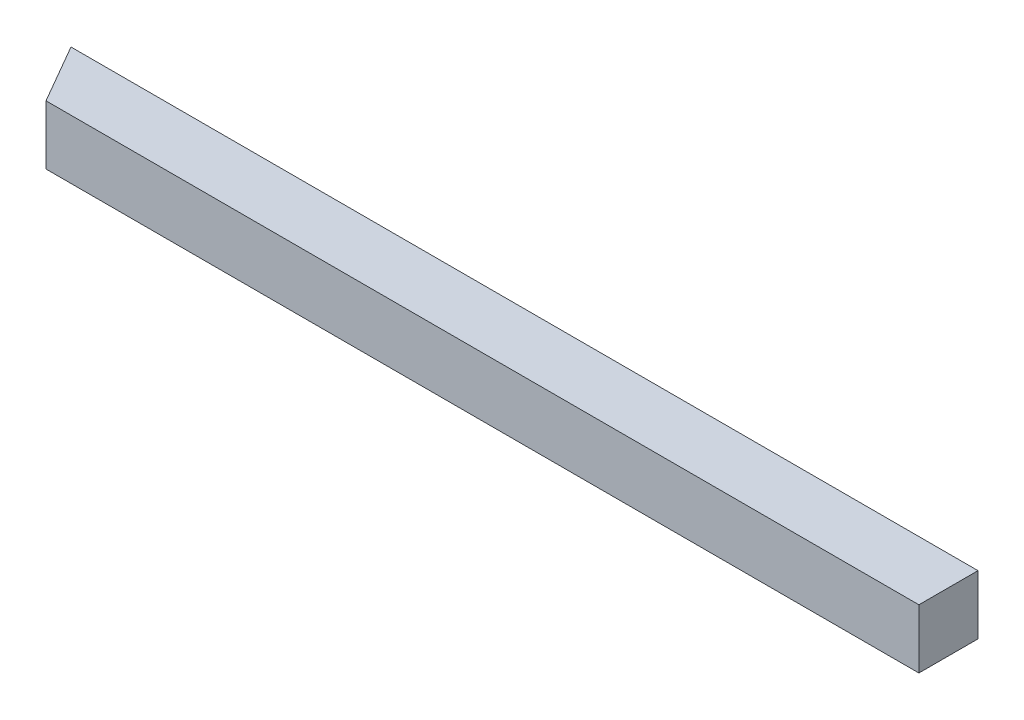
ISO-10303-21;
HEADER;
FILE_DESCRIPTION(('STEP AP214'),'2;1');
FILE_NAME('part.step','',(''),(''),'','','');
FILE_SCHEMA(('AUTOMOTIVE_DESIGN { 1 0 10303 214 1 1 1 1 }'));
ENDSEC;
DATA;
#1=APPLICATION_CONTEXT('core data for automotive mechanical design processes');
#2=APPLICATION_PROTOCOL_DEFINITION('international standard','automotive_design',2000,#1);
#3=PRODUCT_CONTEXT('',#1,'mechanical');
#4=PRODUCT('Part','Part','',(#3));
#5=PRODUCT_RELATED_PRODUCT_CATEGORY('part','',(#4));
#6=PRODUCT_DEFINITION_FORMATION('','',#4);
#7=PRODUCT_DEFINITION_CONTEXT('part definition',#1,'design');
#8=PRODUCT_DEFINITION('design','',#6,#7);
#9=PRODUCT_DEFINITION_SHAPE('','',#8);
#10=(LENGTH_UNIT() NAMED_UNIT(*) SI_UNIT(.MILLI.,.METRE.));
#11=(NAMED_UNIT(*) PLANE_ANGLE_UNIT() SI_UNIT($,.RADIAN.));
#12=(NAMED_UNIT(*) SI_UNIT($,.STERADIAN.) SOLID_ANGLE_UNIT());
#13=UNCERTAINTY_MEASURE_WITH_UNIT(LENGTH_MEASURE(1.E-05),#10,'distance_accuracy_value','');
#14=(GEOMETRIC_REPRESENTATION_CONTEXT(3) GLOBAL_UNCERTAINTY_ASSIGNED_CONTEXT((#13)) GLOBAL_UNIT_ASSIGNED_CONTEXT((#10,
#11,#12)) REPRESENTATION_CONTEXT('',''));
#15=CARTESIAN_POINT('',(0.,0.,0.));
#16=DIRECTION('',(0.,0.,1.));
#17=DIRECTION('',(1.,0.,0.));
#18=AXIS2_PLACEMENT_3D('',#15,#16,#17);
#19=CARTESIAN_POINT('',(293.094010767585,20.,200.));
#20=DIRECTION('',(0.866025403784439,0.,-0.5));
#21=DIRECTION('',(-0.5,0.,-0.866025403784439));
#22=AXIS2_PLACEMENT_3D('',#19,#20,#21);
#23=PLANE('',#22);
#24=DIRECTION('',(0.5,0.,0.866025403784439));
#25=VECTOR('',#24,1.);
#26=CARTESIAN_POINT('',(293.094010767585,0.,200.));
#27=LINE('',#26,#25);
#28=CARTESIAN_POINT('',(293.094010767585,0.,200.));
#29=VERTEX_POINT('',#28);
#30=CARTESIAN_POINT('',(304.641016151378,0.,220.));
#31=VERTEX_POINT('',#30);
#32=EDGE_CURVE('E107',#29,#31,#27,.T.);
#33=ORIENTED_EDGE('',*,*,#32,.T.);
#34=DIRECTION('',(0.,-1.,0.));
#35=VECTOR('',#34,1.);
#36=CARTESIAN_POINT('',(304.641016151378,20.,220.));
#37=LINE('',#36,#35);
#38=CARTESIAN_POINT('',(304.641016151378,20.,220.));
#39=VERTEX_POINT('',#38);
#40=EDGE_CURVE('E11',#39,#31,#37,.T.);
#41=ORIENTED_EDGE('',*,*,#40,.F.);
#42=DIRECTION('',(0.5,0.,0.866025403784439));
#43=VECTOR('',#42,1.);
#44=CARTESIAN_POINT('',(293.094010767585,20.,200.));
#45=LINE('',#44,#43);
#46=CARTESIAN_POINT('',(293.094010767585,20.,200.));
#47=VERTEX_POINT('',#46);
#48=EDGE_CURVE('E89',#47,#39,#45,.T.);
#49=ORIENTED_EDGE('',*,*,#48,.F.);
#50=DIRECTION('',(0.,-1.,0.));
#51=VECTOR('',#50,1.);
#52=CARTESIAN_POINT('',(293.094010767585,20.,200.));
#53=LINE('',#52,#51);
#54=EDGE_CURVE('E56',#47,#29,#53,.T.);
#55=ORIENTED_EDGE('',*,*,#54,.T.);
#56=EDGE_LOOP('',(#33,#41,#49,#55));
#57=FACE_BOUND('',#56,.T.);
#58=ADVANCED_FACE('F39',(#57),#23,.F.);
#59=CARTESIAN_POINT('',(304.641016151378,20.,220.));
#60=DIRECTION('',(0.,0.,-1.));
#61=DIRECTION('',(-1.,0.,0.));
#62=AXIS2_PLACEMENT_3D('',#59,#60,#61);
#63=PLANE('',#62);
#64=DIRECTION('',(1.,0.,0.));
#65=VECTOR('',#64,1.);
#66=CARTESIAN_POINT('',(304.641016151378,0.,220.));
#67=LINE('',#66,#65);
#68=CARTESIAN_POINT('',(600.,0.,220.));
#69=VERTEX_POINT('',#68);
#70=EDGE_CURVE('E95',#31,#69,#67,.T.);
#71=ORIENTED_EDGE('',*,*,#70,.T.);
#72=DIRECTION('',(0.,-1.,0.));
#73=VECTOR('',#72,1.);
#74=CARTESIAN_POINT('',(600.,20.,220.));
#75=LINE('',#74,#73);
#76=CARTESIAN_POINT('',(600.,20.,220.));
#77=VERTEX_POINT('',#76);
#78=EDGE_CURVE('E48',#77,#69,#75,.T.);
#79=ORIENTED_EDGE('',*,*,#78,.F.);
#80=DIRECTION('',(1.,0.,0.));
#81=VECTOR('',#80,1.);
#82=CARTESIAN_POINT('',(304.641016151378,20.,220.));
#83=LINE('',#82,#81);
#84=EDGE_CURVE('E81',#39,#77,#83,.T.);
#85=ORIENTED_EDGE('',*,*,#84,.F.);
#86=ORIENTED_EDGE('',*,*,#40,.T.);
#87=EDGE_LOOP('',(#71,#79,#85,#86));
#88=FACE_BOUND('',#87,.T.);
#89=ADVANCED_FACE('F94',(#88),#63,.F.);
#90=CARTESIAN_POINT('',(600.,20.,200.));
#91=DIRECTION('',(1.,0.,0.));
#92=DIRECTION('',(0.,0.,-1.));
#93=AXIS2_PLACEMENT_3D('',#90,#91,#92);
#94=PLANE('',#93);
#95=DIRECTION('',(0.,0.,1.));
#96=VECTOR('',#95,1.);
#97=CARTESIAN_POINT('',(600.,0.,200.));
#98=LINE('',#97,#96);
#99=CARTESIAN_POINT('',(600.,0.,200.));
#100=VERTEX_POINT('',#99);
#101=EDGE_CURVE('E112',#100,#69,#98,.T.);
#102=ORIENTED_EDGE('',*,*,#101,.F.);
#103=DIRECTION('',(0.,-1.,0.));
#104=VECTOR('',#103,1.);
#105=CARTESIAN_POINT('',(600.,20.,200.));
#106=LINE('',#105,#104);
#107=CARTESIAN_POINT('',(600.,20.,200.));
#108=VERTEX_POINT('',#107);
#109=EDGE_CURVE('E70',#108,#100,#106,.T.);
#110=ORIENTED_EDGE('',*,*,#109,.F.);
#111=DIRECTION('',(0.,0.,1.));
#112=VECTOR('',#111,1.);
#113=CARTESIAN_POINT('',(600.,20.,200.));
#114=LINE('',#113,#112);
#115=EDGE_CURVE('E88',#108,#77,#114,.T.);
#116=ORIENTED_EDGE('',*,*,#115,.T.);
#117=ORIENTED_EDGE('',*,*,#78,.T.);
#118=EDGE_LOOP('',(#102,#110,#116,#117));
#119=FACE_BOUND('',#118,.T.);
#120=ADVANCED_FACE('F99',(#119),#94,.T.);
#121=CARTESIAN_POINT('',(293.094010767585,20.,200.));
#122=DIRECTION('',(0.,0.,-1.));
#123=DIRECTION('',(-1.,0.,0.));
#124=AXIS2_PLACEMENT_3D('',#121,#122,#123);
#125=PLANE('',#124);
#126=DIRECTION('',(1.,0.,0.));
#127=VECTOR('',#126,1.);
#128=CARTESIAN_POINT('',(293.094010767585,0.,200.));
#129=LINE('',#128,#127);
#130=EDGE_CURVE('E115',#29,#100,#129,.T.);
#131=ORIENTED_EDGE('',*,*,#130,.F.);
#132=ORIENTED_EDGE('',*,*,#54,.F.);
#133=DIRECTION('',(1.,0.,0.));
#134=VECTOR('',#133,1.);
#135=CARTESIAN_POINT('',(293.094010767585,20.,200.));
#136=LINE('',#135,#134);
#137=EDGE_CURVE('E101',#47,#108,#136,.T.);
#138=ORIENTED_EDGE('',*,*,#137,.T.);
#139=ORIENTED_EDGE('',*,*,#109,.T.);
#140=EDGE_LOOP('',(#131,#132,#138,#139));
#141=FACE_BOUND('',#140,.T.);
#142=ADVANCED_FACE('F125',(#141),#125,.T.);
#143=CARTESIAN_POINT('',(0.,20.,0.));
#144=DIRECTION('',(0.,1.,0.));
#145=DIRECTION('',(0.,0.,1.));
#146=AXIS2_PLACEMENT_3D('',#143,#144,#145);
#147=PLANE('',#146);
#148=ORIENTED_EDGE('',*,*,#48,.T.);
#149=ORIENTED_EDGE('',*,*,#84,.T.);
#150=ORIENTED_EDGE('',*,*,#115,.F.);
#151=ORIENTED_EDGE('',*,*,#137,.F.);
#152=EDGE_LOOP('',(#148,#149,#150,#151));
#153=FACE_BOUND('',#152,.T.);
#154=ADVANCED_FACE('F85',(#153),#147,.T.);
#155=CARTESIAN_POINT('',(0.,0.,0.));
#156=DIRECTION('',(0.,1.,0.));
#157=DIRECTION('',(0.,0.,1.));
#158=AXIS2_PLACEMENT_3D('',#155,#156,#157);
#159=PLANE('',#158);
#160=ORIENTED_EDGE('',*,*,#32,.F.);
#161=ORIENTED_EDGE('',*,*,#130,.T.);
#162=ORIENTED_EDGE('',*,*,#101,.T.);
#163=ORIENTED_EDGE('',*,*,#70,.F.);
#164=EDGE_LOOP('',(#160,#161,#162,#163));
#165=FACE_BOUND('',#164,.T.);
#166=ADVANCED_FACE('F124',(#165),#159,.F.);
#167=CLOSED_SHELL('',(#58,#89,#120,#142,#154,#166));
#168=MANIFOLD_SOLID_BREP('B2',#167);
#169=ADVANCED_BREP_SHAPE_REPRESENTATION('',(#18,#168),#14);
#170=SHAPE_DEFINITION_REPRESENTATION(#9,#169);
ENDSEC;
END-ISO-10303-21;
